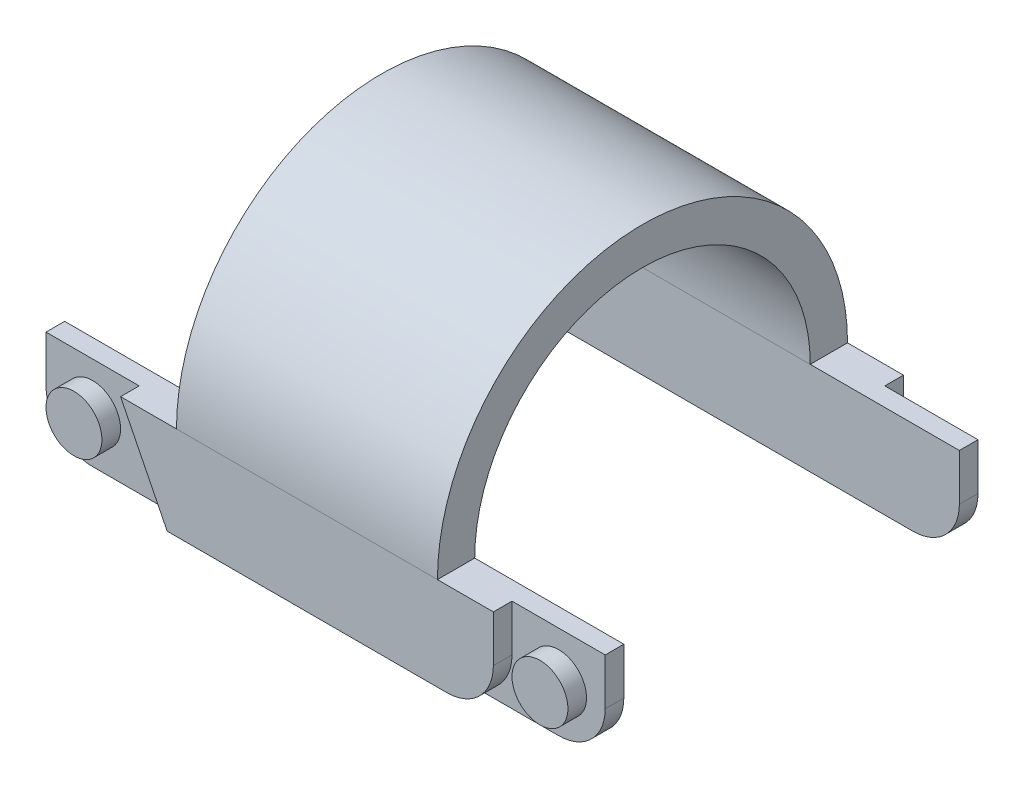
ISO-10303-21;
HEADER;
FILE_DESCRIPTION(('STEP AP214'),'2;1');
FILE_NAME('part.step','',(''),(''),'','','');
FILE_SCHEMA(('AUTOMOTIVE_DESIGN { 1 0 10303 214 1 1 1 1 }'));
ENDSEC;
DATA;
#1=APPLICATION_CONTEXT('core data for automotive mechanical design processes');
#2=APPLICATION_PROTOCOL_DEFINITION('international standard','automotive_design',2000,#1);
#3=PRODUCT_CONTEXT('',#1,'mechanical');
#4=PRODUCT('Part','Part','',(#3));
#5=PRODUCT_RELATED_PRODUCT_CATEGORY('part','',(#4));
#6=PRODUCT_DEFINITION_FORMATION('','',#4);
#7=PRODUCT_DEFINITION_CONTEXT('part definition',#1,'design');
#8=PRODUCT_DEFINITION('design','',#6,#7);
#9=PRODUCT_DEFINITION_SHAPE('','',#8);
#10=(LENGTH_UNIT() NAMED_UNIT(*) SI_UNIT(.MILLI.,.METRE.));
#11=(NAMED_UNIT(*) PLANE_ANGLE_UNIT() SI_UNIT($,.RADIAN.));
#12=(NAMED_UNIT(*) SI_UNIT($,.STERADIAN.) SOLID_ANGLE_UNIT());
#13=UNCERTAINTY_MEASURE_WITH_UNIT(LENGTH_MEASURE(1.E-05),#10,'distance_accuracy_value','');
#14=(GEOMETRIC_REPRESENTATION_CONTEXT(3) GLOBAL_UNCERTAINTY_ASSIGNED_CONTEXT((#13)) GLOBAL_UNIT_ASSIGNED_CONTEXT((#10,
#11,#12)) REPRESENTATION_CONTEXT('',''));
#15=CARTESIAN_POINT('',(0.,0.,0.));
#16=DIRECTION('',(0.,0.,1.));
#17=DIRECTION('',(1.,0.,0.));
#18=AXIS2_PLACEMENT_3D('',#15,#16,#17);
#19=CARTESIAN_POINT('',(0.,0.,10.));
#20=DIRECTION('',(0.,0.,1.));
#21=DIRECTION('',(1.,0.,0.));
#22=AXIS2_PLACEMENT_3D('',#19,#20,#21);
#23=PLANE('',#22);
#24=DIRECTION('',(0.,-1.,0.));
#25=VECTOR('',#24,1.);
#26=CARTESIAN_POINT('',(0.,2.5,10.));
#27=LINE('',#26,#25);
#28=CARTESIAN_POINT('',(0.,2.5,10.));
#29=VERTEX_POINT('',#28);
#30=CARTESIAN_POINT('',(0.,0.,10.));
#31=VERTEX_POINT('',#30);
#32=EDGE_CURVE('E326',#29,#31,#27,.T.);
#33=ORIENTED_EDGE('',*,*,#32,.T.);
#34=CARTESIAN_POINT('',(2.5,0.,10.));
#35=DIRECTION('',(0.,0.,1.));
#36=DIRECTION('',(1.,0.,0.));
#37=AXIS2_PLACEMENT_3D('',#34,#35,#36);
#38=CIRCLE('',#37,2.5);
#39=CARTESIAN_POINT('',(2.5,-2.5,10.));
#40=VERTEX_POINT('',#39);
#41=EDGE_CURVE('E389',#31,#40,#38,.T.);
#42=ORIENTED_EDGE('',*,*,#41,.T.);
#43=DIRECTION('',(1.,0.,0.));
#44=VECTOR('',#43,1.);
#45=CARTESIAN_POINT('',(0.,-2.5,10.));
#46=LINE('',#45,#44);
#47=CARTESIAN_POINT('',(7.5,-2.5,10.));
#48=VERTEX_POINT('',#47);
#49=EDGE_CURVE('E329',#40,#48,#46,.T.);
#50=ORIENTED_EDGE('',*,*,#49,.T.);
#51=DIRECTION('',(-0.447213595499958,0.894427190999916,0.));
#52=VECTOR('',#51,1.);
#53=CARTESIAN_POINT('',(5.,2.5,10.));
#54=LINE('',#53,#52);
#55=CARTESIAN_POINT('',(5.,2.5,10.));
#56=VERTEX_POINT('',#55);
#57=EDGE_CURVE('E437',#48,#56,#54,.T.);
#58=ORIENTED_EDGE('',*,*,#57,.T.);
#59=DIRECTION('',(-1.,0.,0.));
#60=VECTOR('',#59,1.);
#61=CARTESIAN_POINT('',(0.,2.5,10.));
#62=LINE('',#61,#60);
#63=EDGE_CURVE('E331',#56,#29,#62,.T.);
#64=ORIENTED_EDGE('',*,*,#63,.T.);
#65=EDGE_LOOP('',(#33,#42,#50,#58,#64));
#66=FACE_BOUND('',#65,.T.);
#67=CARTESIAN_POINT('',(2.5,0.,10.));
#68=DIRECTION('',(0.,0.,1.));
#69=DIRECTION('',(1.,0.,0.));
#70=AXIS2_PLACEMENT_3D('',#67,#68,#69);
#71=CIRCLE('',#70,1.5);
#72=CARTESIAN_POINT('',(4.,0.,10.));
#73=VERTEX_POINT('',#72);
#74=EDGE_CURVE('E444',#73,#73,#71,.T.);
#75=ORIENTED_EDGE('',*,*,#74,.F.);
#76=EDGE_LOOP('',(#75));
#77=FACE_BOUND('',#76,.T.);
#78=ADVANCED_FACE('F35',(#66,#77),#23,.T.);
#79=CARTESIAN_POINT('',(0.,0.,10.));
#80=DIRECTION('',(0.,0.,-1.));
#81=DIRECTION('',(-1.,0.,0.));
#82=AXIS2_PLACEMENT_3D('',#79,#80,#81);
#83=PLANE('',#82);
#84=DIRECTION('',(1.,0.,0.));
#85=VECTOR('',#84,1.);
#86=CARTESIAN_POINT('',(30.,-2.5,10.));
#87=LINE('',#86,#85);
#88=CARTESIAN_POINT('',(22.5,-2.5,10.));
#89=VERTEX_POINT('',#88);
#90=CARTESIAN_POINT('',(27.5,-2.5,10.));
#91=VERTEX_POINT('',#90);
#92=EDGE_CURVE('E319',#89,#91,#87,.T.);
#93=ORIENTED_EDGE('',*,*,#92,.T.);
#94=CARTESIAN_POINT('',(27.5,0.,10.));
#95=DIRECTION('',(0.,0.,-1.));
#96=DIRECTION('',(-1.,0.,0.));
#97=AXIS2_PLACEMENT_3D('',#94,#95,#96);
#98=CIRCLE('',#97,2.5);
#99=CARTESIAN_POINT('',(30.,0.,10.));
#100=VERTEX_POINT('',#99);
#101=EDGE_CURVE('E399',#91,#100,#98,.F.);
#102=ORIENTED_EDGE('',*,*,#101,.T.);
#103=DIRECTION('',(0.,1.,0.));
#104=VECTOR('',#103,1.);
#105=CARTESIAN_POINT('',(30.,2.5,10.));
#106=LINE('',#105,#104);
#107=CARTESIAN_POINT('',(30.,2.5,10.));
#108=VERTEX_POINT('',#107);
#109=EDGE_CURVE('E311',#100,#108,#106,.T.);
#110=ORIENTED_EDGE('',*,*,#109,.T.);
#111=DIRECTION('',(-1.,0.,0.));
#112=VECTOR('',#111,1.);
#113=CARTESIAN_POINT('',(30.,2.5,10.));
#114=LINE('',#113,#112);
#115=CARTESIAN_POINT('',(25.,2.5,10.));
#116=VERTEX_POINT('',#115);
#117=EDGE_CURVE('E313',#108,#116,#114,.T.);
#118=ORIENTED_EDGE('',*,*,#117,.T.);
#119=DIRECTION('',(0.,-1.,0.));
#120=VECTOR('',#119,1.);
#121=CARTESIAN_POINT('',(25.,2.5,10.));
#122=LINE('',#121,#120);
#123=CARTESIAN_POINT('',(25.,0.,10.));
#124=VERTEX_POINT('',#123);
#125=EDGE_CURVE('E316',#116,#124,#122,.T.);
#126=ORIENTED_EDGE('',*,*,#125,.T.);
#127=CARTESIAN_POINT('',(22.5,0.,10.));
#128=DIRECTION('',(0.,0.,-1.));
#129=DIRECTION('',(-1.,0.,0.));
#130=AXIS2_PLACEMENT_3D('',#127,#128,#129);
#131=CIRCLE('',#130,2.5);
#132=EDGE_CURVE('E43',#124,#89,#131,.T.);
#133=ORIENTED_EDGE('',*,*,#132,.T.);
#134=EDGE_LOOP('',(#93,#102,#110,#118,#126,#133));
#135=FACE_BOUND('',#134,.T.);
#136=CARTESIAN_POINT('',(27.5,0.,10.));
#137=DIRECTION('',(0.,0.,-1.));
#138=DIRECTION('',(-1.,0.,0.));
#139=AXIS2_PLACEMENT_3D('',#136,#137,#138);
#140=CIRCLE('',#139,1.5);
#141=CARTESIAN_POINT('',(26.,0.,10.));
#142=VERTEX_POINT('',#141);
#143=EDGE_CURVE('E362',#142,#142,#140,.F.);
#144=ORIENTED_EDGE('',*,*,#143,.F.);
#145=EDGE_LOOP('',(#144));
#146=FACE_BOUND('',#145,.T.);
#147=ADVANCED_FACE('F417',(#135,#146),#83,.F.);
#148=CARTESIAN_POINT('',(0.,0.,-10.));
#149=DIRECTION('',(0.,0.,-1.));
#150=DIRECTION('',(0.,1.,0.));
#151=AXIS2_PLACEMENT_3D('',#148,#149,#150);
#152=PLANE('',#151);
#153=DIRECTION('',(0.,-1.,0.));
#154=VECTOR('',#153,1.);
#155=CARTESIAN_POINT('',(30.,2.5,-10.));
#156=LINE('',#155,#154);
#157=CARTESIAN_POINT('',(30.,2.5,-10.));
#158=VERTEX_POINT('',#157);
#159=CARTESIAN_POINT('',(30.,0.,-10.));
#160=VERTEX_POINT('',#159);
#161=EDGE_CURVE('E239',#158,#160,#156,.T.);
#162=ORIENTED_EDGE('',*,*,#161,.T.);
#163=CARTESIAN_POINT('',(27.5,0.,-10.));
#164=DIRECTION('',(0.,0.,-1.));
#165=DIRECTION('',(0.,1.,0.));
#166=AXIS2_PLACEMENT_3D('',#163,#164,#165);
#167=CIRCLE('',#166,2.5);
#168=CARTESIAN_POINT('',(27.5,-2.5,-10.));
#169=VERTEX_POINT('',#168);
#170=EDGE_CURVE('E394',#160,#169,#167,.T.);
#171=ORIENTED_EDGE('',*,*,#170,.T.);
#172=DIRECTION('',(-1.,0.,0.));
#173=VECTOR('',#172,1.);
#174=CARTESIAN_POINT('',(30.,-2.5,-10.));
#175=LINE('',#174,#173);
#176=CARTESIAN_POINT('',(22.5,-2.5,-10.));
#177=VERTEX_POINT('',#176);
#178=EDGE_CURVE('E49',#169,#177,#175,.T.);
#179=ORIENTED_EDGE('',*,*,#178,.T.);
#180=CARTESIAN_POINT('',(22.5,0.,-10.));
#181=DIRECTION('',(0.,0.,-1.));
#182=DIRECTION('',(0.,1.,0.));
#183=AXIS2_PLACEMENT_3D('',#180,#181,#182);
#184=CIRCLE('',#183,2.5);
#185=CARTESIAN_POINT('',(25.,0.,-10.));
#186=VERTEX_POINT('',#185);
#187=EDGE_CURVE('E11',#177,#186,#184,.F.);
#188=ORIENTED_EDGE('',*,*,#187,.T.);
#189=DIRECTION('',(0.,1.,0.));
#190=VECTOR('',#189,1.);
#191=CARTESIAN_POINT('',(25.,2.5,-10.));
#192=LINE('',#191,#190);
#193=CARTESIAN_POINT('',(25.,2.5,-10.));
#194=VERTEX_POINT('',#193);
#195=EDGE_CURVE('E246',#186,#194,#192,.T.);
#196=ORIENTED_EDGE('',*,*,#195,.T.);
#197=DIRECTION('',(1.,0.,0.));
#198=VECTOR('',#197,1.);
#199=CARTESIAN_POINT('',(30.,2.5,-10.));
#200=LINE('',#199,#198);
#201=EDGE_CURVE('E248',#194,#158,#200,.T.);
#202=ORIENTED_EDGE('',*,*,#201,.T.);
#203=EDGE_LOOP('',(#162,#171,#179,#188,#196,#202));
#204=FACE_BOUND('',#203,.T.);
#205=CARTESIAN_POINT('',(27.5,0.,-10.));
#206=DIRECTION('',(0.,0.,-1.));
#207=DIRECTION('',(0.,1.,0.));
#208=AXIS2_PLACEMENT_3D('',#205,#206,#207);
#209=CIRCLE('',#208,1.5);
#210=CARTESIAN_POINT('',(27.5,1.5,-10.));
#211=VERTEX_POINT('',#210);
#212=EDGE_CURVE('E453',#211,#211,#209,.T.);
#213=ORIENTED_EDGE('',*,*,#212,.F.);
#214=EDGE_LOOP('',(#213));
#215=FACE_BOUND('',#214,.T.);
#216=ADVANCED_FACE('F474',(#204,#215),#152,.T.);
#217=CARTESIAN_POINT('',(0.,0.,-10.));
#218=DIRECTION('',(0.,0.,1.));
#219=DIRECTION('',(0.,-1.,0.));
#220=AXIS2_PLACEMENT_3D('',#217,#218,#219);
#221=PLANE('',#220);
#222=DIRECTION('',(-1.,0.,0.));
#223=VECTOR('',#222,1.);
#224=CARTESIAN_POINT('',(0.,-2.5,-10.));
#225=LINE('',#224,#223);
#226=CARTESIAN_POINT('',(7.5,-2.5,-10.));
#227=VERTEX_POINT('',#226);
#228=CARTESIAN_POINT('',(2.5,-2.5,-10.));
#229=VERTEX_POINT('',#228);
#230=EDGE_CURVE('E229',#227,#229,#225,.T.);
#231=ORIENTED_EDGE('',*,*,#230,.T.);
#232=CARTESIAN_POINT('',(2.5,0.,-10.));
#233=DIRECTION('',(0.,0.,1.));
#234=DIRECTION('',(0.,-1.,0.));
#235=AXIS2_PLACEMENT_3D('',#232,#233,#234);
#236=CIRCLE('',#235,2.5);
#237=CARTESIAN_POINT('',(0.,0.,-10.));
#238=VERTEX_POINT('',#237);
#239=EDGE_CURVE('E370',#229,#238,#236,.F.);
#240=ORIENTED_EDGE('',*,*,#239,.T.);
#241=DIRECTION('',(0.,1.,0.));
#242=VECTOR('',#241,1.);
#243=CARTESIAN_POINT('',(0.,2.5,-10.));
#244=LINE('',#243,#242);
#245=CARTESIAN_POINT('',(0.,2.5,-10.));
#246=VERTEX_POINT('',#245);
#247=EDGE_CURVE('E225',#238,#246,#244,.T.);
#248=ORIENTED_EDGE('',*,*,#247,.T.);
#249=DIRECTION('',(1.,0.,0.));
#250=VECTOR('',#249,1.);
#251=CARTESIAN_POINT('',(0.,2.5,-10.));
#252=LINE('',#251,#250);
#253=CARTESIAN_POINT('',(5.,2.5,-10.));
#254=VERTEX_POINT('',#253);
#255=EDGE_CURVE('E221',#246,#254,#252,.T.);
#256=ORIENTED_EDGE('',*,*,#255,.T.);
#257=DIRECTION('',(0.447213595499958,-0.894427190999916,0.));
#258=VECTOR('',#257,1.);
#259=CARTESIAN_POINT('',(5.,2.5,-10.));
#260=LINE('',#259,#258);
#261=EDGE_CURVE('E207',#254,#227,#260,.T.);
#262=ORIENTED_EDGE('',*,*,#261,.T.);
#263=EDGE_LOOP('',(#231,#240,#248,#256,#262));
#264=FACE_BOUND('',#263,.T.);
#265=CARTESIAN_POINT('',(2.5,0.,-10.));
#266=DIRECTION('',(0.,0.,1.));
#267=DIRECTION('',(0.,-1.,0.));
#268=AXIS2_PLACEMENT_3D('',#265,#266,#267);
#269=CIRCLE('',#268,1.5);
#270=CARTESIAN_POINT('',(2.5,-1.5,-10.));
#271=VERTEX_POINT('',#270);
#272=EDGE_CURVE('E359',#271,#271,#269,.F.);
#273=ORIENTED_EDGE('',*,*,#272,.F.);
#274=EDGE_LOOP('',(#273));
#275=FACE_BOUND('',#274,.T.);
#276=ADVANCED_FACE('F222',(#264,#275),#221,.F.);
#277=CARTESIAN_POINT('',(30.,2.5,11.));
#278=DIRECTION('',(0.,-1.,0.));
#279=DIRECTION('',(0.,0.,-1.));
#280=AXIS2_PLACEMENT_3D('',#277,#278,#279);
#281=PLANE('',#280);
#282=DIRECTION('',(0.,0.,1.));
#283=VECTOR('',#282,1.);
#284=CARTESIAN_POINT('',(8.,2.5,9.));
#285=LINE('',#284,#283);
#286=CARTESIAN_POINT('',(8.,2.5,9.));
#287=VERTEX_POINT('',#286);
#288=CARTESIAN_POINT('',(8.,2.5,11.));
#289=VERTEX_POINT('',#288);
#290=EDGE_CURVE('E275',#287,#289,#285,.T.);
#291=ORIENTED_EDGE('',*,*,#290,.F.);
#292=DIRECTION('',(-1.,0.,0.));
#293=VECTOR('',#292,1.);
#294=CARTESIAN_POINT('',(30.,2.5,9.));
#295=LINE('',#294,#293);
#296=CARTESIAN_POINT('',(0.,2.5,9.));
#297=VERTEX_POINT('',#296);
#298=EDGE_CURVE('E350',#287,#297,#295,.T.);
#299=ORIENTED_EDGE('',*,*,#298,.T.);
#300=DIRECTION('',(0.,0.,1.));
#301=VECTOR('',#300,1.);
#302=CARTESIAN_POINT('',(0.,2.5,11.));
#303=LINE('',#302,#301);
#304=EDGE_CURVE('E340',#297,#29,#303,.T.);
#305=ORIENTED_EDGE('',*,*,#304,.T.);
#306=ORIENTED_EDGE('',*,*,#63,.F.);
#307=DIRECTION('',(0.,0.,1.));
#308=VECTOR('',#307,1.);
#309=CARTESIAN_POINT('',(5.,2.5,10.));
#310=LINE('',#309,#308);
#311=CARTESIAN_POINT('',(5.,2.5,11.));
#312=VERTEX_POINT('',#311);
#313=EDGE_CURVE('E333',#56,#312,#310,.T.);
#314=ORIENTED_EDGE('',*,*,#313,.T.);
#315=DIRECTION('',(-1.,0.,0.));
#316=VECTOR('',#315,1.);
#317=CARTESIAN_POINT('',(30.,2.5,11.));
#318=LINE('',#317,#316);
#319=EDGE_CURVE('E343',#289,#312,#318,.T.);
#320=ORIENTED_EDGE('',*,*,#319,.F.);
#321=EDGE_LOOP('',(#291,#299,#305,#306,#314,#320));
#322=FACE_BOUND('',#321,.T.);
#323=ADVANCED_FACE('F473',(#322),#281,.F.);
#324=DIRECTION('',(0.,0.,-1.));
#325=VECTOR('',#324,1.);
#326=CARTESIAN_POINT('',(22.,2.5,9.));
#327=LINE('',#326,#325);
#328=CARTESIAN_POINT('',(22.,2.5,11.));
#329=VERTEX_POINT('',#328);
#330=CARTESIAN_POINT('',(22.,2.5,9.));
#331=VERTEX_POINT('',#330);
#332=EDGE_CURVE('E281',#329,#331,#327,.T.);
#333=ORIENTED_EDGE('',*,*,#332,.F.);
#334=CARTESIAN_POINT('',(25.,2.5,11.));
#335=VERTEX_POINT('',#334);
#336=EDGE_CURVE('E347',#335,#329,#318,.T.);
#337=ORIENTED_EDGE('',*,*,#336,.F.);
#338=DIRECTION('',(0.,0.,1.));
#339=VECTOR('',#338,1.);
#340=CARTESIAN_POINT('',(25.,2.5,10.));
#341=LINE('',#340,#339);
#342=EDGE_CURVE('E322',#116,#335,#341,.T.);
#343=ORIENTED_EDGE('',*,*,#342,.F.);
#344=ORIENTED_EDGE('',*,*,#117,.F.);
#345=DIRECTION('',(0.,0.,1.));
#346=VECTOR('',#345,1.);
#347=CARTESIAN_POINT('',(30.,2.5,11.));
#348=LINE('',#347,#346);
#349=CARTESIAN_POINT('',(30.,2.5,9.));
#350=VERTEX_POINT('',#349);
#351=EDGE_CURVE('E339',#350,#108,#348,.T.);
#352=ORIENTED_EDGE('',*,*,#351,.F.);
#353=EDGE_CURVE('E351',#350,#331,#295,.T.);
#354=ORIENTED_EDGE('',*,*,#353,.T.);
#355=EDGE_LOOP('',(#333,#337,#343,#344,#352,#354));
#356=FACE_BOUND('',#355,.T.);
#357=ADVANCED_FACE('F480',(#356),#281,.F.);
#358=CARTESIAN_POINT('',(0.,0.,0.));
#359=DIRECTION('',(1.,0.,0.));
#360=DIRECTION('',(0.,0.,-1.));
#361=AXIS2_PLACEMENT_3D('',#358,#359,#360);
#362=PLANE('',#361);
#363=DIRECTION('',(0.,1.,0.));
#364=VECTOR('',#363,1.);
#365=CARTESIAN_POINT('',(0.,2.5,9.));
#366=LINE('',#365,#364);
#367=CARTESIAN_POINT('',(0.,0.,9.));
#368=VERTEX_POINT('',#367);
#369=EDGE_CURVE('E336',#368,#297,#366,.T.);
#370=ORIENTED_EDGE('',*,*,#369,.F.);
#371=DIRECTION('',(0.,0.,-1.));
#372=VECTOR('',#371,1.);
#373=CARTESIAN_POINT('',(0.,0.,0.));
#374=LINE('',#373,#372);
#375=EDGE_CURVE('E387',#368,#31,#374,.F.);
#376=ORIENTED_EDGE('',*,*,#375,.T.);
#377=ORIENTED_EDGE('',*,*,#32,.F.);
#378=ORIENTED_EDGE('',*,*,#304,.F.);
#379=EDGE_LOOP('',(#370,#376,#377,#378));
#380=FACE_BOUND('',#379,.T.);
#381=ADVANCED_FACE('F500',(#380),#362,.F.);
#382=CARTESIAN_POINT('',(30.,2.5,11.));
#383=DIRECTION('',(0.,0.,-1.));
#384=DIRECTION('',(0.,1.,0.));
#385=AXIS2_PLACEMENT_3D('',#382,#383,#384);
#386=PLANE('',#385);
#387=DIRECTION('',(-1.,0.,0.));
#388=VECTOR('',#387,1.);
#389=CARTESIAN_POINT('',(30.,-2.5,11.));
#390=LINE('',#389,#388);
#391=CARTESIAN_POINT('',(22.5,-2.5,11.));
#392=VERTEX_POINT('',#391);
#393=CARTESIAN_POINT('',(7.5,-2.5,11.));
#394=VERTEX_POINT('',#393);
#395=EDGE_CURVE('E357',#392,#394,#390,.T.);
#396=ORIENTED_EDGE('',*,*,#395,.F.);
#397=CARTESIAN_POINT('',(22.5,0.,11.));
#398=DIRECTION('',(0.,0.,-1.));
#399=DIRECTION('',(0.,1.,0.));
#400=AXIS2_PLACEMENT_3D('',#397,#398,#399);
#401=CIRCLE('',#400,2.5);
#402=CARTESIAN_POINT('',(25.,0.,11.));
#403=VERTEX_POINT('',#402);
#404=EDGE_CURVE('E404',#392,#403,#401,.F.);
#405=ORIENTED_EDGE('',*,*,#404,.T.);
#406=DIRECTION('',(0.,-1.,0.));
#407=VECTOR('',#406,1.);
#408=CARTESIAN_POINT('',(25.,2.5,11.));
#409=LINE('',#408,#407);
#410=EDGE_CURVE('E310',#335,#403,#409,.T.);
#411=ORIENTED_EDGE('',*,*,#410,.F.);
#412=ORIENTED_EDGE('',*,*,#336,.T.);
#413=DIRECTION('',(1.,0.,0.));
#414=VECTOR('',#413,1.);
#415=CARTESIAN_POINT('',(8.,2.5,11.));
#416=LINE('',#415,#414);
#417=EDGE_CURVE('E278',#289,#329,#416,.T.);
#418=ORIENTED_EDGE('',*,*,#417,.F.);
#419=ORIENTED_EDGE('',*,*,#319,.T.);
#420=DIRECTION('',(-0.447213595499958,0.894427190999916,0.));
#421=VECTOR('',#420,1.);
#422=CARTESIAN_POINT('',(5.,2.5,11.));
#423=LINE('',#422,#421);
#424=EDGE_CURVE('E433',#394,#312,#423,.T.);
#425=ORIENTED_EDGE('',*,*,#424,.F.);
#426=EDGE_LOOP('',(#396,#405,#411,#412,#418,#419,#425));
#427=FACE_BOUND('',#426,.T.);
#428=ADVANCED_FACE('F430',(#427),#386,.F.);
#429=CARTESIAN_POINT('',(30.,-2.5,11.));
#430=DIRECTION('',(0.,1.,0.));
#431=DIRECTION('',(0.,0.,1.));
#432=AXIS2_PLACEMENT_3D('',#429,#430,#431);
#433=PLANE('',#432);
#434=ORIENTED_EDGE('',*,*,#92,.F.);
#435=DIRECTION('',(0.,0.,1.));
#436=VECTOR('',#435,1.);
#437=CARTESIAN_POINT('',(22.5,-2.5,11.));
#438=LINE('',#437,#436);
#439=EDGE_CURVE('E401',#89,#392,#438,.T.);
#440=ORIENTED_EDGE('',*,*,#439,.T.);
#441=ORIENTED_EDGE('',*,*,#395,.T.);
#442=DIRECTION('',(0.,0.,1.));
#443=VECTOR('',#442,1.);
#444=CARTESIAN_POINT('',(7.5,-2.5,10.));
#445=LINE('',#444,#443);
#446=EDGE_CURVE('E439',#48,#394,#445,.T.);
#447=ORIENTED_EDGE('',*,*,#446,.F.);
#448=ORIENTED_EDGE('',*,*,#49,.F.);
#449=DIRECTION('',(0.,0.,-1.));
#450=VECTOR('',#449,1.);
#451=CARTESIAN_POINT('',(2.5,-2.5,11.));
#452=LINE('',#451,#450);
#453=CARTESIAN_POINT('',(2.5,-2.5,9.));
#454=VERTEX_POINT('',#453);
#455=EDGE_CURVE('E380',#40,#454,#452,.T.);
#456=ORIENTED_EDGE('',*,*,#455,.T.);
#457=DIRECTION('',(-1.,0.,0.));
#458=VECTOR('',#457,1.);
#459=CARTESIAN_POINT('',(30.,-2.5,9.));
#460=LINE('',#459,#458);
#461=CARTESIAN_POINT('',(27.5,-2.5,9.));
#462=VERTEX_POINT('',#461);
#463=EDGE_CURVE('E354',#462,#454,#460,.T.);
#464=ORIENTED_EDGE('',*,*,#463,.F.);
#465=DIRECTION('',(0.,0.,-1.));
#466=VECTOR('',#465,1.);
#467=CARTESIAN_POINT('',(27.5,-2.5,10.));
#468=LINE('',#467,#466);
#469=EDGE_CURVE('E378',#462,#91,#468,.F.);
#470=ORIENTED_EDGE('',*,*,#469,.T.);
#471=EDGE_LOOP('',(#434,#440,#441,#447,#448,#456,#464,#470));
#472=FACE_BOUND('',#471,.T.);
#473=ADVANCED_FACE('F425',(#472),#433,.F.);
#474=CARTESIAN_POINT('',(30.,2.5,9.));
#475=DIRECTION('',(0.,0.,1.));
#476=DIRECTION('',(1.,0.,0.));
#477=AXIS2_PLACEMENT_3D('',#474,#475,#476);
#478=PLANE('',#477);
#479=ORIENTED_EDGE('',*,*,#463,.T.);
#480=CARTESIAN_POINT('',(2.5,0.,9.));
#481=DIRECTION('',(0.,0.,1.));
#482=DIRECTION('',(1.,0.,0.));
#483=AXIS2_PLACEMENT_3D('',#480,#481,#482);
#484=CIRCLE('',#483,2.5);
#485=EDGE_CURVE('E385',#454,#368,#484,.F.);
#486=ORIENTED_EDGE('',*,*,#485,.T.);
#487=ORIENTED_EDGE('',*,*,#369,.T.);
#488=ORIENTED_EDGE('',*,*,#298,.F.);
#489=DIRECTION('',(-1.,0.,0.));
#490=VECTOR('',#489,1.);
#491=CARTESIAN_POINT('',(8.,2.5,9.));
#492=LINE('',#491,#490);
#493=EDGE_CURVE('E284',#331,#287,#492,.T.);
#494=ORIENTED_EDGE('',*,*,#493,.F.);
#495=ORIENTED_EDGE('',*,*,#353,.F.);
#496=DIRECTION('',(0.,1.,0.));
#497=VECTOR('',#496,1.);
#498=CARTESIAN_POINT('',(30.,2.5,9.));
#499=LINE('',#498,#497);
#500=CARTESIAN_POINT('',(30.,0.,9.));
#501=VERTEX_POINT('',#500);
#502=EDGE_CURVE('E337',#501,#350,#499,.T.);
#503=ORIENTED_EDGE('',*,*,#502,.F.);
#504=CARTESIAN_POINT('',(27.5,0.,9.));
#505=DIRECTION('',(0.,0.,1.));
#506=DIRECTION('',(1.,0.,0.));
#507=AXIS2_PLACEMENT_3D('',#504,#505,#506);
#508=CIRCLE('',#507,2.5);
#509=EDGE_CURVE('E383',#501,#462,#508,.F.);
#510=ORIENTED_EDGE('',*,*,#509,.T.);
#511=EDGE_LOOP('',(#479,#486,#487,#488,#494,#495,#503,#510));
#512=FACE_BOUND('',#511,.T.);
#513=ADVANCED_FACE('F498',(#512),#478,.F.);
#514=CARTESIAN_POINT('',(30.,0.,0.));
#515=DIRECTION('',(1.,0.,0.));
#516=DIRECTION('',(0.,0.,-1.));
#517=AXIS2_PLACEMENT_3D('',#514,#515,#516);
#518=PLANE('',#517);
#519=ORIENTED_EDGE('',*,*,#109,.F.);
#520=DIRECTION('',(0.,0.,-1.));
#521=VECTOR('',#520,1.);
#522=CARTESIAN_POINT('',(30.,0.,9.));
#523=LINE('',#522,#521);
#524=EDGE_CURVE('E396',#100,#501,#523,.T.);
#525=ORIENTED_EDGE('',*,*,#524,.T.);
#526=ORIENTED_EDGE('',*,*,#502,.T.);
#527=ORIENTED_EDGE('',*,*,#351,.T.);
#528=EDGE_LOOP('',(#519,#525,#526,#527));
#529=FACE_BOUND('',#528,.T.);
#530=ADVANCED_FACE('F495',(#529),#518,.T.);
#531=CARTESIAN_POINT('',(25.,2.5,10.));
#532=DIRECTION('',(-1.,0.,0.));
#533=DIRECTION('',(0.,0.,1.));
#534=AXIS2_PLACEMENT_3D('',#531,#532,#533);
#535=PLANE('',#534);
#536=ORIENTED_EDGE('',*,*,#410,.T.);
#537=DIRECTION('',(0.,0.,1.));
#538=VECTOR('',#537,1.);
#539=CARTESIAN_POINT('',(25.,0.,10.));
#540=LINE('',#539,#538);
#541=EDGE_CURVE('E406',#403,#124,#540,.F.);
#542=ORIENTED_EDGE('',*,*,#541,.T.);
#543=ORIENTED_EDGE('',*,*,#125,.F.);
#544=ORIENTED_EDGE('',*,*,#342,.T.);
#545=EDGE_LOOP('',(#536,#542,#543,#544));
#546=FACE_BOUND('',#545,.T.);
#547=ADVANCED_FACE('F494',(#546),#535,.F.);
#548=CARTESIAN_POINT('',(8.,2.5,-9.));
#549=DIRECTION('',(1.,0.,0.));
#550=DIRECTION('',(0.,0.,-1.));
#551=AXIS2_PLACEMENT_3D('',#548,#549,#550);
#552=PLANE('',#551);
#553=CARTESIAN_POINT('',(8.,2.5,0.));
#554=DIRECTION('',(1.,0.,0.));
#555=DIRECTION('',(0.,0.,-1.));
#556=AXIS2_PLACEMENT_3D('',#553,#554,#555);
#557=CIRCLE('',#556,11.);
#558=CARTESIAN_POINT('',(8.,2.5,-11.));
#559=VERTEX_POINT('',#558);
#560=EDGE_CURVE('E307',#559,#289,#557,.T.);
#561=ORIENTED_EDGE('',*,*,#560,.F.);
#562=DIRECTION('',(0.,0.,-1.));
#563=VECTOR('',#562,1.);
#564=CARTESIAN_POINT('',(8.,2.5,-9.));
#565=LINE('',#564,#563);
#566=CARTESIAN_POINT('',(8.,2.5,-9.));
#567=VERTEX_POINT('',#566);
#568=EDGE_CURVE('E287',#567,#559,#565,.T.);
#569=ORIENTED_EDGE('',*,*,#568,.F.);
#570=CARTESIAN_POINT('',(8.,2.5,0.));
#571=DIRECTION('',(1.,0.,0.));
#572=DIRECTION('',(0.,0.,-1.));
#573=AXIS2_PLACEMENT_3D('',#570,#571,#572);
#574=CIRCLE('',#573,9.);
#575=EDGE_CURVE('E298',#567,#287,#574,.T.);
#576=ORIENTED_EDGE('',*,*,#575,.T.);
#577=ORIENTED_EDGE('',*,*,#290,.T.);
#578=EDGE_LOOP('',(#561,#569,#576,#577));
#579=FACE_BOUND('',#578,.T.);
#580=ADVANCED_FACE('F678',(#579),#552,.F.);
#581=CARTESIAN_POINT('',(10.,2.5,0.));
#582=DIRECTION('',(1.,0.,0.));
#583=DIRECTION('',(0.,0.,-1.));
#584=AXIS2_PLACEMENT_3D('',#581,#582,#583);
#585=CYLINDRICAL_SURFACE('',#584,11.);
#586=CARTESIAN_POINT('',(22.,2.5,0.));
#587=DIRECTION('',(1.,0.,0.));
#588=DIRECTION('',(0.,0.,-1.));
#589=AXIS2_PLACEMENT_3D('',#586,#587,#588);
#590=CIRCLE('',#589,11.);
#591=CARTESIAN_POINT('',(22.,2.5,-11.));
#592=VERTEX_POINT('',#591);
#593=EDGE_CURVE('E304',#592,#329,#590,.T.);
#594=ORIENTED_EDGE('',*,*,#593,.F.);
#595=DIRECTION('',(1.,0.,0.));
#596=VECTOR('',#595,1.);
#597=CARTESIAN_POINT('',(8.,2.5,-11.));
#598=LINE('',#597,#596);
#599=EDGE_CURVE('E289',#559,#592,#598,.T.);
#600=ORIENTED_EDGE('',*,*,#599,.F.);
#601=ORIENTED_EDGE('',*,*,#560,.T.);
#602=ORIENTED_EDGE('',*,*,#417,.T.);
#603=EDGE_LOOP('',(#594,#600,#601,#602));
#604=FACE_BOUND('',#603,.T.);
#605=ADVANCED_FACE('F777',(#604),#585,.T.);
#606=CARTESIAN_POINT('',(22.,2.5,-9.));
#607=DIRECTION('',(-1.,0.,0.));
#608=DIRECTION('',(0.,0.,1.));
#609=AXIS2_PLACEMENT_3D('',#606,#607,#608);
#610=PLANE('',#609);
#611=CARTESIAN_POINT('',(22.,2.5,0.));
#612=DIRECTION('',(1.,0.,0.));
#613=DIRECTION('',(0.,0.,-1.));
#614=AXIS2_PLACEMENT_3D('',#611,#612,#613);
#615=CIRCLE('',#614,9.);
#616=CARTESIAN_POINT('',(22.,2.5,-9.));
#617=VERTEX_POINT('',#616);
#618=EDGE_CURVE('E301',#617,#331,#615,.T.);
#619=ORIENTED_EDGE('',*,*,#618,.F.);
#620=DIRECTION('',(0.,0.,1.));
#621=VECTOR('',#620,1.);
#622=CARTESIAN_POINT('',(22.,2.5,-9.));
#623=LINE('',#622,#621);
#624=EDGE_CURVE('E292',#592,#617,#623,.T.);
#625=ORIENTED_EDGE('',*,*,#624,.F.);
#626=ORIENTED_EDGE('',*,*,#593,.T.);
#627=ORIENTED_EDGE('',*,*,#332,.T.);
#628=EDGE_LOOP('',(#619,#625,#626,#627));
#629=FACE_BOUND('',#628,.T.);
#630=ADVANCED_FACE('F787',(#629),#610,.F.);
#631=CARTESIAN_POINT('',(10.,2.5,0.));
#632=DIRECTION('',(1.,0.,0.));
#633=DIRECTION('',(0.,0.,-1.));
#634=AXIS2_PLACEMENT_3D('',#631,#632,#633);
#635=CYLINDRICAL_SURFACE('',#634,9.);
#636=DIRECTION('',(-1.,0.,0.));
#637=VECTOR('',#636,1.);
#638=CARTESIAN_POINT('',(8.,2.5,-9.));
#639=LINE('',#638,#637);
#640=EDGE_CURVE('E295',#617,#567,#639,.T.);
#641=ORIENTED_EDGE('',*,*,#640,.F.);
#642=ORIENTED_EDGE('',*,*,#618,.T.);
#643=ORIENTED_EDGE('',*,*,#493,.T.);
#644=ORIENTED_EDGE('',*,*,#575,.F.);
#645=EDGE_LOOP('',(#641,#642,#643,#644));
#646=FACE_BOUND('',#645,.T.);
#647=ADVANCED_FACE('F634',(#646),#635,.F.);
#648=CARTESIAN_POINT('',(30.,2.5,-11.));
#649=DIRECTION('',(0.,-1.,0.));
#650=DIRECTION('',(0.,0.,-1.));
#651=AXIS2_PLACEMENT_3D('',#648,#649,#650);
#652=PLANE('',#651);
#653=DIRECTION('',(-1.,0.,0.));
#654=VECTOR('',#653,1.);
#655=CARTESIAN_POINT('',(30.,2.5,-9.));
#656=LINE('',#655,#654);
#657=CARTESIAN_POINT('',(0.,2.5,-9.));
#658=VERTEX_POINT('',#657);
#659=EDGE_CURVE('E268',#567,#658,#656,.T.);
#660=ORIENTED_EDGE('',*,*,#659,.F.);
#661=ORIENTED_EDGE('',*,*,#568,.T.);
#662=DIRECTION('',(-1.,0.,0.));
#663=VECTOR('',#662,1.);
#664=CARTESIAN_POINT('',(30.,2.5,-11.));
#665=LINE('',#664,#663);
#666=CARTESIAN_POINT('',(5.,2.5,-11.));
#667=VERTEX_POINT('',#666);
#668=EDGE_CURVE('E236',#559,#667,#665,.T.);
#669=ORIENTED_EDGE('',*,*,#668,.T.);
#670=DIRECTION('',(0.,0.,-1.));
#671=VECTOR('',#670,1.);
#672=CARTESIAN_POINT('',(5.,2.5,-10.));
#673=LINE('',#672,#671);
#674=EDGE_CURVE('E212',#254,#667,#673,.T.);
#675=ORIENTED_EDGE('',*,*,#674,.F.);
#676=ORIENTED_EDGE('',*,*,#255,.F.);
#677=DIRECTION('',(0.,0.,1.));
#678=VECTOR('',#677,1.);
#679=CARTESIAN_POINT('',(0.,2.5,-11.));
#680=LINE('',#679,#678);
#681=EDGE_CURVE('E253',#246,#658,#680,.T.);
#682=ORIENTED_EDGE('',*,*,#681,.T.);
#683=EDGE_LOOP('',(#660,#661,#669,#675,#676,#682));
#684=FACE_BOUND('',#683,.T.);
#685=ADVANCED_FACE('F233',(#684),#652,.F.);
#686=CARTESIAN_POINT('',(25.,2.5,-11.));
#687=VERTEX_POINT('',#686);
#688=EDGE_CURVE('E272',#687,#592,#665,.T.);
#689=ORIENTED_EDGE('',*,*,#688,.T.);
#690=ORIENTED_EDGE('',*,*,#624,.T.);
#691=CARTESIAN_POINT('',(30.,2.5,-9.));
#692=VERTEX_POINT('',#691);
#693=EDGE_CURVE('E269',#692,#617,#656,.T.);
#694=ORIENTED_EDGE('',*,*,#693,.F.);
#695=DIRECTION('',(0.,0.,1.));
#696=VECTOR('',#695,1.);
#697=CARTESIAN_POINT('',(30.,2.5,-11.));
#698=LINE('',#697,#696);
#699=EDGE_CURVE('E254',#158,#692,#698,.T.);
#700=ORIENTED_EDGE('',*,*,#699,.F.);
#701=ORIENTED_EDGE('',*,*,#201,.F.);
#702=DIRECTION('',(0.,0.,-1.));
#703=VECTOR('',#702,1.);
#704=CARTESIAN_POINT('',(25.,2.5,-10.));
#705=LINE('',#704,#703);
#706=EDGE_CURVE('E249',#194,#687,#705,.T.);
#707=ORIENTED_EDGE('',*,*,#706,.T.);
#708=EDGE_LOOP('',(#689,#690,#694,#700,#701,#707));
#709=FACE_BOUND('',#708,.T.);
#710=ADVANCED_FACE('F633',(#709),#652,.F.);
#711=CARTESIAN_POINT('',(30.,0.,0.));
#712=DIRECTION('',(-1.,0.,0.));
#713=DIRECTION('',(0.,0.,1.));
#714=AXIS2_PLACEMENT_3D('',#711,#712,#713);
#715=PLANE('',#714);
#716=DIRECTION('',(0.,-1.,0.));
#717=VECTOR('',#716,1.);
#718=CARTESIAN_POINT('',(30.,2.5,-9.));
#719=LINE('',#718,#717);
#720=CARTESIAN_POINT('',(30.,0.,-9.));
#721=VERTEX_POINT('',#720);
#722=EDGE_CURVE('E256',#692,#721,#719,.T.);
#723=ORIENTED_EDGE('',*,*,#722,.T.);
#724=DIRECTION('',(0.,0.,-1.));
#725=VECTOR('',#724,1.);
#726=CARTESIAN_POINT('',(30.,0.,0.));
#727=LINE('',#726,#725);
#728=EDGE_CURVE('E391',#721,#160,#727,.T.);
#729=ORIENTED_EDGE('',*,*,#728,.T.);
#730=ORIENTED_EDGE('',*,*,#161,.F.);
#731=ORIENTED_EDGE('',*,*,#699,.T.);
#732=EDGE_LOOP('',(#723,#729,#730,#731));
#733=FACE_BOUND('',#732,.T.);
#734=ADVANCED_FACE('F692',(#733),#715,.F.);
#735=CARTESIAN_POINT('',(30.,2.5,-11.));
#736=DIRECTION('',(0.,0.,1.));
#737=DIRECTION('',(0.,-1.,0.));
#738=AXIS2_PLACEMENT_3D('',#735,#736,#737);
#739=PLANE('',#738);
#740=DIRECTION('',(0.,1.,0.));
#741=VECTOR('',#740,1.);
#742=CARTESIAN_POINT('',(25.,2.5,-11.));
#743=LINE('',#742,#741);
#744=CARTESIAN_POINT('',(25.,0.,-11.));
#745=VERTEX_POINT('',#744);
#746=EDGE_CURVE('E237',#745,#687,#743,.T.);
#747=ORIENTED_EDGE('',*,*,#746,.F.);
#748=CARTESIAN_POINT('',(22.5,0.,-11.));
#749=DIRECTION('',(0.,0.,1.));
#750=DIRECTION('',(0.,-1.,0.));
#751=AXIS2_PLACEMENT_3D('',#748,#749,#750);
#752=CIRCLE('',#751,2.5);
#753=CARTESIAN_POINT('',(22.5,-2.5,-11.));
#754=VERTEX_POINT('',#753);
#755=EDGE_CURVE('E57',#745,#754,#752,.F.);
#756=ORIENTED_EDGE('',*,*,#755,.T.);
#757=DIRECTION('',(-1.,0.,0.));
#758=VECTOR('',#757,1.);
#759=CARTESIAN_POINT('',(30.,-2.5,-11.));
#760=LINE('',#759,#758);
#761=CARTESIAN_POINT('',(7.5,-2.5,-11.));
#762=VERTEX_POINT('',#761);
#763=EDGE_CURVE('E260',#754,#762,#760,.T.);
#764=ORIENTED_EDGE('',*,*,#763,.T.);
#765=DIRECTION('',(0.447213595499958,-0.894427190999916,0.));
#766=VECTOR('',#765,1.);
#767=CARTESIAN_POINT('',(5.,2.5,-11.));
#768=LINE('',#767,#766);
#769=EDGE_CURVE('E218',#667,#762,#768,.T.);
#770=ORIENTED_EDGE('',*,*,#769,.F.);
#771=ORIENTED_EDGE('',*,*,#668,.F.);
#772=ORIENTED_EDGE('',*,*,#599,.T.);
#773=ORIENTED_EDGE('',*,*,#688,.F.);
#774=EDGE_LOOP('',(#747,#756,#764,#770,#771,#772,#773));
#775=FACE_BOUND('',#774,.T.);
#776=ADVANCED_FACE('F686',(#775),#739,.F.);
#777=CARTESIAN_POINT('',(30.,2.5,-9.));
#778=DIRECTION('',(0.,0.,-1.));
#779=DIRECTION('',(-1.,0.,0.));
#780=AXIS2_PLACEMENT_3D('',#777,#778,#779);
#781=PLANE('',#780);
#782=DIRECTION('',(0.,-1.,0.));
#783=VECTOR('',#782,1.);
#784=CARTESIAN_POINT('',(0.,2.5,-9.));
#785=LINE('',#784,#783);
#786=CARTESIAN_POINT('',(0.,0.,-9.));
#787=VERTEX_POINT('',#786);
#788=EDGE_CURVE('E257',#658,#787,#785,.T.);
#789=ORIENTED_EDGE('',*,*,#788,.T.);
#790=CARTESIAN_POINT('',(2.5,0.,-9.));
#791=DIRECTION('',(0.,0.,-1.));
#792=DIRECTION('',(-1.,0.,0.));
#793=AXIS2_PLACEMENT_3D('',#790,#791,#792);
#794=CIRCLE('',#793,2.5);
#795=CARTESIAN_POINT('',(2.5,-2.5,-9.));
#796=VERTEX_POINT('',#795);
#797=EDGE_CURVE('E376',#787,#796,#794,.F.);
#798=ORIENTED_EDGE('',*,*,#797,.T.);
#799=DIRECTION('',(-1.,0.,0.));
#800=VECTOR('',#799,1.);
#801=CARTESIAN_POINT('',(30.,-2.5,-9.));
#802=LINE('',#801,#800);
#803=CARTESIAN_POINT('',(27.5,-2.5,-9.));
#804=VERTEX_POINT('',#803);
#805=EDGE_CURVE('E265',#804,#796,#802,.T.);
#806=ORIENTED_EDGE('',*,*,#805,.F.);
#807=CARTESIAN_POINT('',(27.5,0.,-9.));
#808=DIRECTION('',(0.,0.,-1.));
#809=DIRECTION('',(-1.,0.,0.));
#810=AXIS2_PLACEMENT_3D('',#807,#808,#809);
#811=CIRCLE('',#810,2.5);
#812=EDGE_CURVE('E374',#804,#721,#811,.F.);
#813=ORIENTED_EDGE('',*,*,#812,.T.);
#814=ORIENTED_EDGE('',*,*,#722,.F.);
#815=ORIENTED_EDGE('',*,*,#693,.T.);
#816=ORIENTED_EDGE('',*,*,#640,.T.);
#817=ORIENTED_EDGE('',*,*,#659,.T.);
#818=EDGE_LOOP('',(#789,#798,#806,#813,#814,#815,#816,#817));
#819=FACE_BOUND('',#818,.T.);
#820=ADVANCED_FACE('F691',(#819),#781,.F.);
#821=CARTESIAN_POINT('',(30.,-2.5,-11.));
#822=DIRECTION('',(0.,1.,0.));
#823=DIRECTION('',(0.,0.,1.));
#824=AXIS2_PLACEMENT_3D('',#821,#822,#823);
#825=PLANE('',#824);
#826=ORIENTED_EDGE('',*,*,#763,.F.);
#827=DIRECTION('',(0.,0.,-1.));
#828=VECTOR('',#827,1.);
#829=CARTESIAN_POINT('',(22.5,-2.5,-11.));
#830=LINE('',#829,#828);
#831=EDGE_CURVE('E412',#754,#177,#830,.F.);
#832=ORIENTED_EDGE('',*,*,#831,.T.);
#833=ORIENTED_EDGE('',*,*,#178,.F.);
#834=DIRECTION('',(0.,0.,-1.));
#835=VECTOR('',#834,1.);
#836=CARTESIAN_POINT('',(27.5,-2.5,-11.));
#837=LINE('',#836,#835);
#838=EDGE_CURVE('E365',#169,#804,#837,.F.);
#839=ORIENTED_EDGE('',*,*,#838,.T.);
#840=ORIENTED_EDGE('',*,*,#805,.T.);
#841=DIRECTION('',(0.,0.,-1.));
#842=VECTOR('',#841,1.);
#843=CARTESIAN_POINT('',(2.5,-2.5,-10.));
#844=LINE('',#843,#842);
#845=EDGE_CURVE('E367',#796,#229,#844,.T.);
#846=ORIENTED_EDGE('',*,*,#845,.T.);
#847=ORIENTED_EDGE('',*,*,#230,.F.);
#848=DIRECTION('',(0.,0.,-1.));
#849=VECTOR('',#848,1.);
#850=CARTESIAN_POINT('',(7.5,-2.5,-10.));
#851=LINE('',#850,#849);
#852=EDGE_CURVE('E215',#227,#762,#851,.T.);
#853=ORIENTED_EDGE('',*,*,#852,.T.);
#854=EDGE_LOOP('',(#826,#832,#833,#839,#840,#846,#847,#853));
#855=FACE_BOUND('',#854,.T.);
#856=ADVANCED_FACE('F701',(#855),#825,.F.);
#857=CARTESIAN_POINT('',(0.,0.,0.));
#858=DIRECTION('',(-1.,0.,0.));
#859=DIRECTION('',(0.,0.,1.));
#860=AXIS2_PLACEMENT_3D('',#857,#858,#859);
#861=PLANE('',#860);
#862=ORIENTED_EDGE('',*,*,#247,.F.);
#863=DIRECTION('',(0.,0.,-1.));
#864=VECTOR('',#863,1.);
#865=CARTESIAN_POINT('',(0.,0.,-9.));
#866=LINE('',#865,#864);
#867=EDGE_CURVE('E372',#238,#787,#866,.F.);
#868=ORIENTED_EDGE('',*,*,#867,.T.);
#869=ORIENTED_EDGE('',*,*,#788,.F.);
#870=ORIENTED_EDGE('',*,*,#681,.F.);
#871=EDGE_LOOP('',(#862,#868,#869,#870));
#872=FACE_BOUND('',#871,.T.);
#873=ADVANCED_FACE('F706',(#872),#861,.T.);
#874=CARTESIAN_POINT('',(25.,2.5,-10.));
#875=DIRECTION('',(-1.,0.,0.));
#876=DIRECTION('',(0.,0.,1.));
#877=AXIS2_PLACEMENT_3D('',#874,#875,#876);
#878=PLANE('',#877);
#879=ORIENTED_EDGE('',*,*,#195,.F.);
#880=DIRECTION('',(0.,0.,-1.));
#881=VECTOR('',#880,1.);
#882=CARTESIAN_POINT('',(25.,0.,-10.));
#883=LINE('',#882,#881);
#884=EDGE_CURVE('E408',#186,#745,#883,.T.);
#885=ORIENTED_EDGE('',*,*,#884,.T.);
#886=ORIENTED_EDGE('',*,*,#746,.T.);
#887=ORIENTED_EDGE('',*,*,#706,.F.);
#888=EDGE_LOOP('',(#879,#885,#886,#887));
#889=FACE_BOUND('',#888,.T.);
#890=ADVANCED_FACE('F469',(#889),#878,.F.);
#891=CARTESIAN_POINT('',(2.5,0.,-11.));
#892=DIRECTION('',(0.,0.,1.));
#893=DIRECTION('',(0.,-1.,0.));
#894=AXIS2_PLACEMENT_3D('',#891,#892,#893);
#895=CYLINDRICAL_SURFACE('',#894,1.5);
#896=CARTESIAN_POINT('',(2.5,0.,-11.));
#897=DIRECTION('',(0.,0.,-1.));
#898=DIRECTION('',(0.,1.,0.));
#899=AXIS2_PLACEMENT_3D('',#896,#897,#898);
#900=CIRCLE('',#899,1.5);
#901=CARTESIAN_POINT('',(2.5,1.50000000000001,-11.));
#902=VERTEX_POINT('',#901);
#903=EDGE_CURVE('E457',#902,#902,#900,.T.);
#904=ORIENTED_EDGE('',*,*,#903,.F.);
#905=EDGE_LOOP('',(#904));
#906=FACE_BOUND('',#905,.T.);
#907=ORIENTED_EDGE('',*,*,#272,.T.);
#908=EDGE_LOOP('',(#907));
#909=FACE_BOUND('',#908,.T.);
#910=ADVANCED_FACE('F466',(#906,#909),#895,.T.);
#911=CARTESIAN_POINT('',(2.5,0.,-11.));
#912=DIRECTION('',(0.,0.,-1.));
#913=DIRECTION('',(0.,1.,0.));
#914=AXIS2_PLACEMENT_3D('',#911,#912,#913);
#915=PLANE('',#914);
#916=ORIENTED_EDGE('',*,*,#903,.T.);
#917=EDGE_LOOP('',(#916));
#918=FACE_BOUND('',#917,.T.);
#919=ADVANCED_FACE('F464',(#918),#915,.T.);
#920=CARTESIAN_POINT('',(27.5,0.,-11.));
#921=DIRECTION('',(0.,0.,1.));
#922=DIRECTION('',(0.,-1.,0.));
#923=AXIS2_PLACEMENT_3D('',#920,#921,#922);
#924=CYLINDRICAL_SURFACE('',#923,1.5);
#925=CARTESIAN_POINT('',(27.5,0.,-11.));
#926=DIRECTION('',(0.,0.,-1.));
#927=DIRECTION('',(0.,1.,0.));
#928=AXIS2_PLACEMENT_3D('',#925,#926,#927);
#929=CIRCLE('',#928,1.5);
#930=CARTESIAN_POINT('',(27.5,1.5,-11.));
#931=VERTEX_POINT('',#930);
#932=EDGE_CURVE('E454',#931,#931,#929,.T.);
#933=ORIENTED_EDGE('',*,*,#932,.F.);
#934=EDGE_LOOP('',(#933));
#935=FACE_BOUND('',#934,.T.);
#936=ORIENTED_EDGE('',*,*,#212,.T.);
#937=EDGE_LOOP('',(#936));
#938=FACE_BOUND('',#937,.T.);
#939=ADVANCED_FACE('F558',(#935,#938),#924,.T.);
#940=CARTESIAN_POINT('',(27.5,0.,-11.));
#941=DIRECTION('',(0.,0.,-1.));
#942=DIRECTION('',(0.,1.,0.));
#943=AXIS2_PLACEMENT_3D('',#940,#941,#942);
#944=PLANE('',#943);
#945=ORIENTED_EDGE('',*,*,#932,.T.);
#946=EDGE_LOOP('',(#945));
#947=FACE_BOUND('',#946,.T.);
#948=ADVANCED_FACE('F554',(#947),#944,.T.);
#949=CARTESIAN_POINT('',(27.5,0.,11.));
#950=DIRECTION('',(0.,0.,-1.));
#951=DIRECTION('',(-1.,0.,0.));
#952=AXIS2_PLACEMENT_3D('',#949,#950,#951);
#953=CYLINDRICAL_SURFACE('',#952,1.5);
#954=CARTESIAN_POINT('',(27.5,0.,11.));
#955=DIRECTION('',(0.,0.,1.));
#956=DIRECTION('',(1.,0.,0.));
#957=AXIS2_PLACEMENT_3D('',#954,#955,#956);
#958=CIRCLE('',#957,1.5);
#959=CARTESIAN_POINT('',(29.,0.,11.));
#960=VERTEX_POINT('',#959);
#961=EDGE_CURVE('E448',#960,#960,#958,.T.);
#962=ORIENTED_EDGE('',*,*,#961,.F.);
#963=EDGE_LOOP('',(#962));
#964=FACE_BOUND('',#963,.T.);
#965=ORIENTED_EDGE('',*,*,#143,.T.);
#966=EDGE_LOOP('',(#965));
#967=FACE_BOUND('',#966,.T.);
#968=ADVANCED_FACE('F550',(#964,#967),#953,.T.);
#969=CARTESIAN_POINT('',(27.5,0.,11.));
#970=DIRECTION('',(0.,0.,1.));
#971=DIRECTION('',(1.,0.,0.));
#972=AXIS2_PLACEMENT_3D('',#969,#970,#971);
#973=PLANE('',#972);
#974=ORIENTED_EDGE('',*,*,#961,.T.);
#975=EDGE_LOOP('',(#974));
#976=FACE_BOUND('',#975,.T.);
#977=ADVANCED_FACE('F546',(#976),#973,.T.);
#978=CARTESIAN_POINT('',(2.5,0.,11.));
#979=DIRECTION('',(0.,0.,-1.));
#980=DIRECTION('',(-1.,0.,0.));
#981=AXIS2_PLACEMENT_3D('',#978,#979,#980);
#982=CYLINDRICAL_SURFACE('',#981,1.5);
#983=CARTESIAN_POINT('',(2.5,0.,11.));
#984=DIRECTION('',(0.,0.,1.));
#985=DIRECTION('',(1.,0.,0.));
#986=AXIS2_PLACEMENT_3D('',#983,#984,#985);
#987=CIRCLE('',#986,1.5);
#988=CARTESIAN_POINT('',(4.,0.,11.));
#989=VERTEX_POINT('',#988);
#990=EDGE_CURVE('E445',#989,#989,#987,.T.);
#991=ORIENTED_EDGE('',*,*,#990,.F.);
#992=EDGE_LOOP('',(#991));
#993=FACE_BOUND('',#992,.T.);
#994=ORIENTED_EDGE('',*,*,#74,.T.);
#995=EDGE_LOOP('',(#994));
#996=FACE_BOUND('',#995,.T.);
#997=ADVANCED_FACE('F542',(#993,#996),#982,.T.);
#998=CARTESIAN_POINT('',(2.5,0.,11.));
#999=DIRECTION('',(0.,0.,1.));
#1000=DIRECTION('',(1.,0.,0.));
#1001=AXIS2_PLACEMENT_3D('',#998,#999,#1000);
#1002=PLANE('',#1001);
#1003=ORIENTED_EDGE('',*,*,#990,.T.);
#1004=EDGE_LOOP('',(#1003));
#1005=FACE_BOUND('',#1004,.T.);
#1006=ADVANCED_FACE('F515',(#1005),#1002,.T.);
#1007=CARTESIAN_POINT('',(2.5,0.,-11.));
#1008=DIRECTION('',(0.,0.,1.));
#1009=DIRECTION('',(1.,0.,0.));
#1010=AXIS2_PLACEMENT_3D('',#1007,#1008,#1009);
#1011=CYLINDRICAL_SURFACE('',#1010,2.5);
#1012=ORIENTED_EDGE('',*,*,#797,.F.);
#1013=ORIENTED_EDGE('',*,*,#867,.F.);
#1014=ORIENTED_EDGE('',*,*,#239,.F.);
#1015=ORIENTED_EDGE('',*,*,#845,.F.);
#1016=EDGE_LOOP('',(#1012,#1013,#1014,#1015));
#1017=FACE_BOUND('',#1016,.T.);
#1018=ADVANCED_FACE('F511',(#1017),#1011,.T.);
#1019=CARTESIAN_POINT('',(2.5,0.,11.));
#1020=DIRECTION('',(0.,0.,-1.));
#1021=DIRECTION('',(-1.,0.,0.));
#1022=AXIS2_PLACEMENT_3D('',#1019,#1020,#1021);
#1023=CYLINDRICAL_SURFACE('',#1022,2.5);
#1024=ORIENTED_EDGE('',*,*,#41,.F.);
#1025=ORIENTED_EDGE('',*,*,#375,.F.);
#1026=ORIENTED_EDGE('',*,*,#485,.F.);
#1027=ORIENTED_EDGE('',*,*,#455,.F.);
#1028=EDGE_LOOP('',(#1024,#1025,#1026,#1027));
#1029=FACE_BOUND('',#1028,.T.);
#1030=ADVANCED_FACE('F514',(#1029),#1023,.T.);
#1031=CARTESIAN_POINT('',(27.5,0.,0.));
#1032=DIRECTION('',(0.,0.,-1.));
#1033=DIRECTION('',(-1.,0.,0.));
#1034=AXIS2_PLACEMENT_3D('',#1031,#1032,#1033);
#1035=CYLINDRICAL_SURFACE('',#1034,2.5);
#1036=ORIENTED_EDGE('',*,*,#812,.F.);
#1037=ORIENTED_EDGE('',*,*,#838,.F.);
#1038=ORIENTED_EDGE('',*,*,#170,.F.);
#1039=ORIENTED_EDGE('',*,*,#728,.F.);
#1040=EDGE_LOOP('',(#1036,#1037,#1038,#1039));
#1041=FACE_BOUND('',#1040,.T.);
#1042=ADVANCED_FACE('F519',(#1041),#1035,.T.);
#1043=CARTESIAN_POINT('',(27.5,0.,0.));
#1044=DIRECTION('',(0.,0.,1.));
#1045=DIRECTION('',(1.,0.,0.));
#1046=AXIS2_PLACEMENT_3D('',#1043,#1044,#1045);
#1047=CYLINDRICAL_SURFACE('',#1046,2.5);
#1048=ORIENTED_EDGE('',*,*,#101,.F.);
#1049=ORIENTED_EDGE('',*,*,#469,.F.);
#1050=ORIENTED_EDGE('',*,*,#509,.F.);
#1051=ORIENTED_EDGE('',*,*,#524,.F.);
#1052=EDGE_LOOP('',(#1048,#1049,#1050,#1051));
#1053=FACE_BOUND('',#1052,.T.);
#1054=ADVANCED_FACE('F523',(#1053),#1047,.T.);
#1055=CARTESIAN_POINT('',(5.,2.5,10.));
#1056=DIRECTION('',(0.894427190999916,0.447213595499958,0.));
#1057=DIRECTION('',(-0.447213595499958,0.894427190999916,0.));
#1058=AXIS2_PLACEMENT_3D('',#1055,#1056,#1057);
#1059=PLANE('',#1058);
#1060=ORIENTED_EDGE('',*,*,#424,.T.);
#1061=ORIENTED_EDGE('',*,*,#313,.F.);
#1062=ORIENTED_EDGE('',*,*,#57,.F.);
#1063=ORIENTED_EDGE('',*,*,#446,.T.);
#1064=EDGE_LOOP('',(#1060,#1061,#1062,#1063));
#1065=FACE_BOUND('',#1064,.T.);
#1066=ADVANCED_FACE('F526',(#1065),#1059,.F.);
#1067=CARTESIAN_POINT('',(5.,2.5,-10.));
#1068=DIRECTION('',(0.894427190999916,0.447213595499958,0.));
#1069=DIRECTION('',(-0.447213595499958,0.894427190999916,0.));
#1070=AXIS2_PLACEMENT_3D('',#1067,#1068,#1069);
#1071=PLANE('',#1070);
#1072=ORIENTED_EDGE('',*,*,#769,.T.);
#1073=ORIENTED_EDGE('',*,*,#852,.F.);
#1074=ORIENTED_EDGE('',*,*,#261,.F.);
#1075=ORIENTED_EDGE('',*,*,#674,.T.);
#1076=EDGE_LOOP('',(#1072,#1073,#1074,#1075));
#1077=FACE_BOUND('',#1076,.T.);
#1078=ADVANCED_FACE('F210',(#1077),#1071,.F.);
#1079=CARTESIAN_POINT('',(22.5,0.,11.));
#1080=DIRECTION('',(0.,0.,1.));
#1081=DIRECTION('',(1.,0.,0.));
#1082=AXIS2_PLACEMENT_3D('',#1079,#1080,#1081);
#1083=CYLINDRICAL_SURFACE('',#1082,2.5);
#1084=ORIENTED_EDGE('',*,*,#132,.F.);
#1085=ORIENTED_EDGE('',*,*,#541,.F.);
#1086=ORIENTED_EDGE('',*,*,#404,.F.);
#1087=ORIENTED_EDGE('',*,*,#439,.F.);
#1088=EDGE_LOOP('',(#1084,#1085,#1086,#1087));
#1089=FACE_BOUND('',#1088,.T.);
#1090=ADVANCED_FACE('F422',(#1089),#1083,.T.);
#1091=CARTESIAN_POINT('',(22.5,0.,-10.));
#1092=DIRECTION('',(0.,0.,-1.));
#1093=DIRECTION('',(-1.,0.,0.));
#1094=AXIS2_PLACEMENT_3D('',#1091,#1092,#1093);
#1095=CYLINDRICAL_SURFACE('',#1094,2.5);
#1096=ORIENTED_EDGE('',*,*,#187,.F.);
#1097=ORIENTED_EDGE('',*,*,#831,.F.);
#1098=ORIENTED_EDGE('',*,*,#755,.F.);
#1099=ORIENTED_EDGE('',*,*,#884,.F.);
#1100=EDGE_LOOP('',(#1096,#1097,#1098,#1099));
#1101=FACE_BOUND('',#1100,.T.);
#1102=ADVANCED_FACE('F37',(#1101),#1095,.T.);
#1103=CLOSED_SHELL('',(#78,#147,#216,#276,#323,#357,#381,#428,#473,#513,#530,#547,#580,#605,
#630,#647,#685,#710,#734,#776,#820,#856,#873,#890,#910,#919,#939,#948,#968,#977,#997,#1006,
#1018,#1030,#1042,#1054,#1066,#1078,#1090,#1102));
#1104=MANIFOLD_SOLID_BREP('B2',#1103);
#1105=ADVANCED_BREP_SHAPE_REPRESENTATION('',(#18,#1104),#14);
#1106=SHAPE_DEFINITION_REPRESENTATION(#9,#1105);
ENDSEC;
END-ISO-10303-21;
